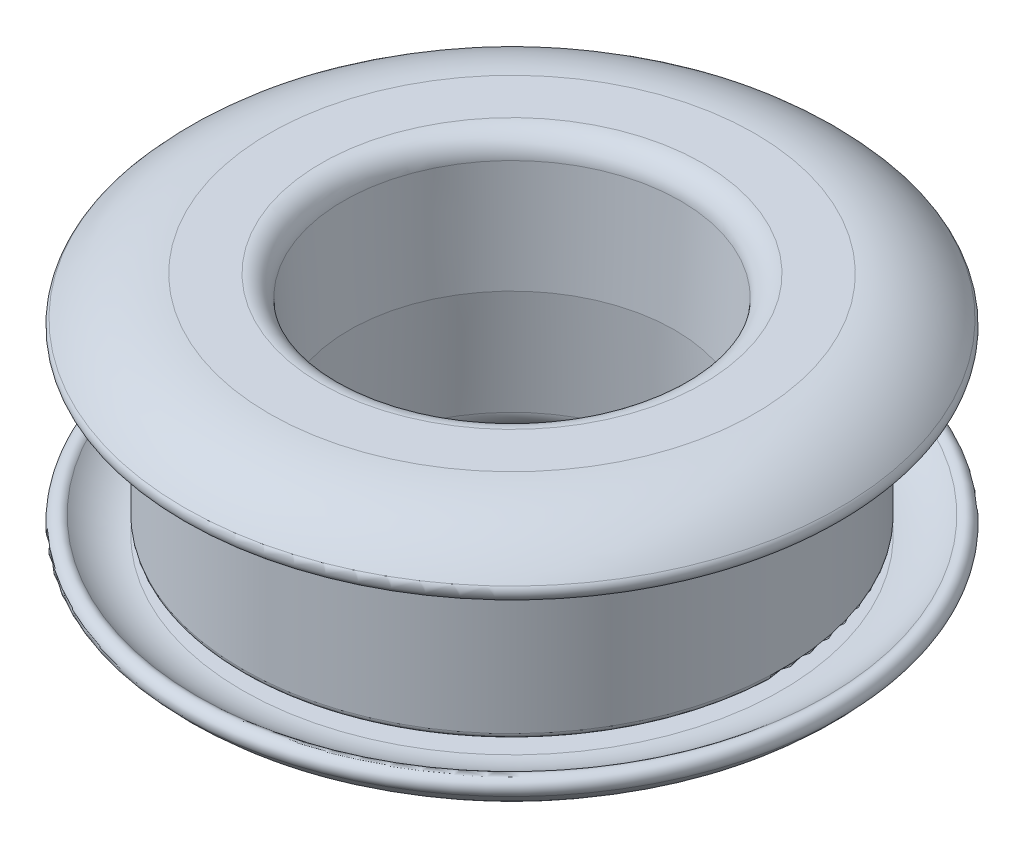
ISO-10303-21;
HEADER;
FILE_DESCRIPTION(('STEP AP214'),'2;1');
FILE_NAME('part.step','',(''),(''),'','','');
FILE_SCHEMA(('AUTOMOTIVE_DESIGN { 1 0 10303 214 1 1 1 1 }'));
ENDSEC;
DATA;
#1=APPLICATION_CONTEXT('core data for automotive mechanical design processes');
#2=APPLICATION_PROTOCOL_DEFINITION('international standard','automotive_design',2000,#1);
#3=PRODUCT_CONTEXT('',#1,'mechanical');
#4=PRODUCT('Part','Part','',(#3));
#5=PRODUCT_RELATED_PRODUCT_CATEGORY('part','',(#4));
#6=PRODUCT_DEFINITION_FORMATION('','',#4);
#7=PRODUCT_DEFINITION_CONTEXT('part definition',#1,'design');
#8=PRODUCT_DEFINITION('design','',#6,#7);
#9=PRODUCT_DEFINITION_SHAPE('','',#8);
#10=(LENGTH_UNIT() NAMED_UNIT(*) SI_UNIT(.MILLI.,.METRE.));
#11=(NAMED_UNIT(*) PLANE_ANGLE_UNIT() SI_UNIT($,.RADIAN.));
#12=(NAMED_UNIT(*) SI_UNIT($,.STERADIAN.) SOLID_ANGLE_UNIT());
#13=UNCERTAINTY_MEASURE_WITH_UNIT(LENGTH_MEASURE(1.E-05),#10,'distance_accuracy_value','');
#14=(GEOMETRIC_REPRESENTATION_CONTEXT(3) GLOBAL_UNCERTAINTY_ASSIGNED_CONTEXT((#13)) GLOBAL_UNIT_ASSIGNED_CONTEXT((#10,
#11,#12)) REPRESENTATION_CONTEXT('',''));
#15=CARTESIAN_POINT('',(0.,0.,0.));
#16=DIRECTION('',(0.,0.,1.));
#17=DIRECTION('',(1.,0.,0.));
#18=AXIS2_PLACEMENT_3D('',#15,#16,#17);
#19=CARTESIAN_POINT('',(0.,12.3249333288571,0.));
#20=DIRECTION('',(0.,1.,0.));
#21=DIRECTION('',(0.,0.,1.));
#22=AXIS2_PLACEMENT_3D('',#19,#20,#21);
#23=CONICAL_SURFACE('',#22,19.05,0.05235987755983);
#24=CARTESIAN_POINT('',(0.,0.,0.));
#25=DIRECTION('',(0.,-1.,0.));
#26=DIRECTION('',(0.,0.,-1.));
#27=AXIS2_PLACEMENT_3D('',#24,#25,#26);
#28=CIRCLE('',#27,18.4040776144231);
#29=CARTESIAN_POINT('',(0.,0.,-18.4040776144231));
#30=VERTEX_POINT('',#29);
#31=EDGE_CURVE('E76',#30,#30,#28,.T.);
#32=ORIENTED_EDGE('',*,*,#31,.T.);
#33=EDGE_LOOP('',(#32));
#34=FACE_BOUND('',#33,.T.);
#35=CARTESIAN_POINT('',(0.,12.3249333288571,0.));
#36=DIRECTION('',(0.,-1.,0.));
#37=DIRECTION('',(0.,0.,-1.));
#38=AXIS2_PLACEMENT_3D('',#35,#36,#37);
#39=CIRCLE('',#38,19.05);
#40=CARTESIAN_POINT('',(0.,12.3249333288571,-19.05));
#41=VERTEX_POINT('',#40);
#42=EDGE_CURVE('E52',#41,#41,#39,.T.);
#43=ORIENTED_EDGE('',*,*,#42,.F.);
#44=EDGE_LOOP('',(#43));
#45=FACE_BOUND('',#44,.T.);
#46=ADVANCED_FACE('F32',(#34,#45),#23,.F.);
#47=CARTESIAN_POINT('',(0.,12.192,0.));
#48=DIRECTION('',(0.,-1.,0.));
#49=DIRECTION('',(0.,0.,-1.));
#50=AXIS2_PLACEMENT_3D('',#47,#48,#49);
#51=TOROIDAL_SURFACE('',#50,21.5865190182766,2.54);
#52=ORIENTED_EDGE('',*,*,#42,.T.);
#53=EDGE_LOOP('',(#52));
#54=FACE_BOUND('',#53,.T.);
#55=CARTESIAN_POINT('',(0.,14.732,0.));
#56=DIRECTION('',(0.,-1.,0.));
#57=DIRECTION('',(0.,0.,-1.));
#58=AXIS2_PLACEMENT_3D('',#55,#56,#57);
#59=CIRCLE('',#58,21.5865190182766);
#60=CARTESIAN_POINT('',(0.,14.732,-21.5865190182766));
#61=VERTEX_POINT('',#60);
#62=EDGE_CURVE('E55',#61,#61,#59,.T.);
#63=ORIENTED_EDGE('',*,*,#62,.F.);
#64=EDGE_LOOP('',(#63));
#65=FACE_BOUND('',#64,.T.);
#66=ADVANCED_FACE('F118',(#54,#65),#51,.T.);
#67=CARTESIAN_POINT('',(21.5865190182766,14.732,0.));
#68=DIRECTION('',(0.,1.,0.));
#69=DIRECTION('',(0.,0.,1.));
#70=AXIS2_PLACEMENT_3D('',#67,#68,#69);
#71=PLANE('',#70);
#72=ORIENTED_EDGE('',*,*,#62,.T.);
#73=EDGE_LOOP('',(#72));
#74=FACE_BOUND('',#73,.T.);
#75=CARTESIAN_POINT('',(0.,14.732,0.));
#76=DIRECTION('',(0.,-1.,0.));
#77=DIRECTION('',(0.,0.,-1.));
#78=AXIS2_PLACEMENT_3D('',#75,#76,#77);
#79=CIRCLE('',#78,27.4444723618816);
#80=CARTESIAN_POINT('',(0.,14.732,-27.4444723618816));
#81=VERTEX_POINT('',#80);
#82=EDGE_CURVE('E58',#81,#81,#79,.T.);
#83=ORIENTED_EDGE('',*,*,#82,.F.);
#84=EDGE_LOOP('',(#83));
#85=FACE_BOUND('',#84,.T.);
#86=ADVANCED_FACE('F124',(#74,#85),#71,.T.);
#87=CARTESIAN_POINT('',(0.,2.17906123567877,0.));
#88=DIRECTION('',(0.,-1.,0.));
#89=DIRECTION('',(0.,0.,-1.));
#90=AXIS2_PLACEMENT_3D('',#87,#88,#89);
#91=TOROIDAL_SURFACE('',#90,27.4444723618816,12.5529387643212);
#92=ORIENTED_EDGE('',*,*,#82,.T.);
#93=EDGE_LOOP('',(#92));
#94=FACE_BOUND('',#93,.T.);
#95=CARTESIAN_POINT('',(0.,10.3021099592483,0.));
#96=DIRECTION('',(0.,-1.,0.));
#97=DIRECTION('',(0.,0.,-1.));
#98=AXIS2_PLACEMENT_3D('',#95,#96,#97);
#99=CIRCLE('',#98,37.0148616463002);
#100=CARTESIAN_POINT('',(0.,10.3021099592483,-37.0148616463002));
#101=VERTEX_POINT('',#100);
#102=EDGE_CURVE('E61',#101,#101,#99,.T.);
#103=ORIENTED_EDGE('',*,*,#102,.F.);
#104=EDGE_LOOP('',(#103));
#105=FACE_BOUND('',#104,.T.);
#106=ADVANCED_FACE('F171',(#94,#105),#91,.T.);
#107=CARTESIAN_POINT('',(0.,9.64465295590468,0.));
#108=DIRECTION('',(0.,-1.,0.));
#109=DIRECTION('',(0.,0.,-1.));
#110=AXIS2_PLACEMENT_3D('',#107,#108,#109);
#111=TOROIDAL_SURFACE('',#110,36.2402609176958,1.016);
#112=ORIENTED_EDGE('',*,*,#102,.T.);
#113=EDGE_LOOP('',(#112));
#114=FACE_BOUND('',#113,.T.);
#115=CARTESIAN_POINT('',(0.,8.89000000000001,0.));
#116=DIRECTION('',(0.,-1.,0.));
#117=DIRECTION('',(0.,0.,-1.));
#118=AXIS2_PLACEMENT_3D('',#115,#116,#117);
#119=CIRCLE('',#118,35.56);
#120=CARTESIAN_POINT('',(0.,8.89000000000001,-35.56));
#121=VERTEX_POINT('',#120);
#122=EDGE_CURVE('E64',#121,#121,#119,.T.);
#123=ORIENTED_EDGE('',*,*,#122,.F.);
#124=EDGE_LOOP('',(#123));
#125=FACE_BOUND('',#124,.T.);
#126=ADVANCED_FACE('F167',(#114,#125),#111,.T.);
#127=CARTESIAN_POINT('',(0.,3.2544608763044,0.));
#128=DIRECTION('',(0.,-1.,0.));
#129=DIRECTION('',(0.,0.,-1.));
#130=AXIS2_PLACEMENT_3D('',#127,#128,#129);
#131=TOROIDAL_SURFACE('',#130,30.48,7.58720641703544);
#132=ORIENTED_EDGE('',*,*,#122,.T.);
#133=EDGE_LOOP('',(#132));
#134=FACE_BOUND('',#133,.T.);
#135=CARTESIAN_POINT('',(0.,10.8416672933398,0.));
#136=DIRECTION('',(0.,-1.,0.));
#137=DIRECTION('',(0.,0.,-1.));
#138=AXIS2_PLACEMENT_3D('',#135,#136,#137);
#139=CIRCLE('',#138,30.48);
#140=CARTESIAN_POINT('',(0.,10.8416672933398,-30.48));
#141=VERTEX_POINT('',#140);
#142=EDGE_CURVE('E67',#141,#141,#139,.T.);
#143=ORIENTED_EDGE('',*,*,#142,.F.);
#144=EDGE_LOOP('',(#143));
#145=FACE_BOUND('',#144,.T.);
#146=ADVANCED_FACE('F161',(#134,#145),#131,.F.);
#147=CARTESIAN_POINT('',(24.820547675882,10.8416672933398,0.));
#148=DIRECTION('',(0.,-1.,0.));
#149=DIRECTION('',(0.,0.,-1.));
#150=AXIS2_PLACEMENT_3D('',#147,#148,#149);
#151=PLANE('',#150);
#152=ORIENTED_EDGE('',*,*,#142,.T.);
#153=EDGE_LOOP('',(#152));
#154=FACE_BOUND('',#153,.T.);
#155=CARTESIAN_POINT('',(0.,10.8416672933398,0.));
#156=DIRECTION('',(0.,-1.,0.));
#157=DIRECTION('',(0.,0.,-1.));
#158=AXIS2_PLACEMENT_3D('',#155,#156,#157);
#159=CIRCLE('',#158,24.820547675882);
#160=CARTESIAN_POINT('',(0.,10.8416672933398,-24.820547675882));
#161=VERTEX_POINT('',#160);
#162=EDGE_CURVE('E70',#161,#161,#159,.T.);
#163=ORIENTED_EDGE('',*,*,#162,.F.);
#164=EDGE_LOOP('',(#163));
#165=FACE_BOUND('',#164,.T.);
#166=ADVANCED_FACE('F155',(#154,#165),#151,.T.);
#167=CARTESIAN_POINT('',(0.,10.1198336466699,0.));
#168=DIRECTION('',(0.,-1.,0.));
#169=DIRECTION('',(0.,0.,-1.));
#170=AXIS2_PLACEMENT_3D('',#167,#168,#169);
#171=TOROIDAL_SURFACE('',#170,24.13,0.998949401186445);
#172=ORIENTED_EDGE('',*,*,#162,.T.);
#173=EDGE_LOOP('',(#172));
#174=FACE_BOUND('',#173,.T.);
#175=CARTESIAN_POINT('',(0.,9.398,0.));
#176=DIRECTION('',(0.,-1.,0.));
#177=DIRECTION('',(0.,0.,-1.));
#178=AXIS2_PLACEMENT_3D('',#175,#176,#177);
#179=CIRCLE('',#178,24.820547675882);
#180=CARTESIAN_POINT('',(0.,9.398,-24.820547675882));
#181=VERTEX_POINT('',#180);
#182=EDGE_CURVE('E73',#181,#181,#179,.T.);
#183=ORIENTED_EDGE('',*,*,#182,.F.);
#184=EDGE_LOOP('',(#183));
#185=FACE_BOUND('',#184,.T.);
#186=ADVANCED_FACE('F150',(#174,#185),#171,.F.);
#187=CARTESIAN_POINT('',(30.48,9.398,0.));
#188=DIRECTION('',(0.,1.,0.));
#189=DIRECTION('',(0.,0.,1.));
#190=AXIS2_PLACEMENT_3D('',#187,#188,#189);
#191=PLANE('',#190);
#192=CARTESIAN_POINT('',(0.,9.398,0.));
#193=DIRECTION('',(0.,1.,0.));
#194=DIRECTION('',(0.,0.,1.));
#195=AXIS2_PLACEMENT_3D('',#192,#193,#194);
#196=CIRCLE('',#195,29.845);
#197=CARTESIAN_POINT('',(0.,9.398,29.845));
#198=VERTEX_POINT('',#197);
#199=EDGE_CURVE('E43',#198,#198,#196,.T.);
#200=ORIENTED_EDGE('',*,*,#199,.T.);
#201=EDGE_LOOP('',(#200));
#202=FACE_BOUND('',#201,.T.);
#203=ORIENTED_EDGE('',*,*,#182,.T.);
#204=EDGE_LOOP('',(#203));
#205=FACE_BOUND('',#204,.T.);
#206=ADVANCED_FACE('F141',(#202,#205),#191,.T.);
#207=CARTESIAN_POINT('',(0.,0.,0.));
#208=DIRECTION('',(0.,-1.,0.));
#209=DIRECTION('',(0.,0.,-1.));
#210=AXIS2_PLACEMENT_3D('',#207,#208,#209);
#211=CYLINDRICAL_SURFACE('',#210,30.48);
#212=CARTESIAN_POINT('',(0.,-8.763,0.));
#213=DIRECTION('',(0.,-1.,0.));
#214=DIRECTION('',(0.,0.,-1.));
#215=AXIS2_PLACEMENT_3D('',#212,#213,#214);
#216=CIRCLE('',#215,30.48);
#217=CARTESIAN_POINT('',(0.,-8.763,-30.48));
#218=VERTEX_POINT('',#217);
#219=EDGE_CURVE('E10',#218,#218,#216,.F.);
#220=ORIENTED_EDGE('',*,*,#219,.T.);
#221=EDGE_LOOP('',(#220));
#222=FACE_BOUND('',#221,.T.);
#223=CARTESIAN_POINT('',(0.,8.763,0.));
#224=DIRECTION('',(0.,1.,0.));
#225=DIRECTION('',(0.,0.,1.));
#226=AXIS2_PLACEMENT_3D('',#223,#224,#225);
#227=CIRCLE('',#226,30.48);
#228=CARTESIAN_POINT('',(0.,8.763,30.48));
#229=VERTEX_POINT('',#228);
#230=EDGE_CURVE('E47',#229,#229,#227,.F.);
#231=ORIENTED_EDGE('',*,*,#230,.T.);
#232=EDGE_LOOP('',(#231));
#233=FACE_BOUND('',#232,.T.);
#234=ADVANCED_FACE('F132',(#222,#233),#211,.T.);
#235=CARTESIAN_POINT('',(0.,8.763,0.));
#236=DIRECTION('',(0.,1.,0.));
#237=DIRECTION('',(0.,0.,1.));
#238=AXIS2_PLACEMENT_3D('',#235,#236,#237);
#239=TOROIDAL_SURFACE('',#238,29.845,0.635);
#240=ORIENTED_EDGE('',*,*,#199,.F.);
#241=EDGE_LOOP('',(#240));
#242=FACE_BOUND('',#241,.T.);
#243=ORIENTED_EDGE('',*,*,#230,.F.);
#244=EDGE_LOOP('',(#243));
#245=FACE_BOUND('',#244,.T.);
#246=ADVANCED_FACE('F129',(#242,#245),#239,.T.);
#247=CARTESIAN_POINT('',(0.,-12.3249333288571,0.));
#248=DIRECTION('',(0.,-1.,0.));
#249=DIRECTION('',(0.,0.,1.));
#250=AXIS2_PLACEMENT_3D('',#247,#248,#249);
#251=CONICAL_SURFACE('',#250,19.05,0.05235987755983);
#252=ORIENTED_EDGE('',*,*,#31,.F.);
#253=EDGE_LOOP('',(#252));
#254=FACE_BOUND('',#253,.T.);
#255=CARTESIAN_POINT('',(0.,-12.3249333288571,0.));
#256=DIRECTION('',(0.,-1.,0.));
#257=DIRECTION('',(0.,0.,-1.));
#258=AXIS2_PLACEMENT_3D('',#255,#256,#257);
#259=CIRCLE('',#258,19.05);
#260=CARTESIAN_POINT('',(0.,-12.3249333288571,-19.05));
#261=VERTEX_POINT('',#260);
#262=EDGE_CURVE('E79',#261,#261,#259,.T.);
#263=ORIENTED_EDGE('',*,*,#262,.T.);
#264=EDGE_LOOP('',(#263));
#265=FACE_BOUND('',#264,.T.);
#266=ADVANCED_FACE('F131',(#254,#265),#251,.F.);
#267=CARTESIAN_POINT('',(0.,-12.192,0.));
#268=DIRECTION('',(0.,1.,0.));
#269=DIRECTION('',(0.,0.,-1.));
#270=AXIS2_PLACEMENT_3D('',#267,#268,#269);
#271=TOROIDAL_SURFACE('',#270,21.5865190182766,2.54);
#272=ORIENTED_EDGE('',*,*,#262,.F.);
#273=EDGE_LOOP('',(#272));
#274=FACE_BOUND('',#273,.T.);
#275=CARTESIAN_POINT('',(0.,-14.732,0.));
#276=DIRECTION('',(0.,-1.,0.));
#277=DIRECTION('',(0.,0.,-1.));
#278=AXIS2_PLACEMENT_3D('',#275,#276,#277);
#279=CIRCLE('',#278,21.5865190182766);
#280=CARTESIAN_POINT('',(0.,-14.732,-21.5865190182766));
#281=VERTEX_POINT('',#280);
#282=EDGE_CURVE('E82',#281,#281,#279,.T.);
#283=ORIENTED_EDGE('',*,*,#282,.T.);
#284=EDGE_LOOP('',(#283));
#285=FACE_BOUND('',#284,.T.);
#286=ADVANCED_FACE('F138',(#274,#285),#271,.T.);
#287=CARTESIAN_POINT('',(21.5865190182766,-14.732,0.));
#288=DIRECTION('',(0.,-1.,0.));
#289=DIRECTION('',(0.,0.,1.));
#290=AXIS2_PLACEMENT_3D('',#287,#288,#289);
#291=PLANE('',#290);
#292=ORIENTED_EDGE('',*,*,#282,.F.);
#293=EDGE_LOOP('',(#292));
#294=FACE_BOUND('',#293,.T.);
#295=CARTESIAN_POINT('',(0.,-14.732,0.));
#296=DIRECTION('',(0.,-1.,0.));
#297=DIRECTION('',(0.,0.,-1.));
#298=AXIS2_PLACEMENT_3D('',#295,#296,#297);
#299=CIRCLE('',#298,27.4444723618816);
#300=CARTESIAN_POINT('',(0.,-14.732,-27.4444723618816));
#301=VERTEX_POINT('',#300);
#302=EDGE_CURVE('E85',#301,#301,#299,.T.);
#303=ORIENTED_EDGE('',*,*,#302,.T.);
#304=EDGE_LOOP('',(#303));
#305=FACE_BOUND('',#304,.T.);
#306=ADVANCED_FACE('F245',(#294,#305),#291,.T.);
#307=CARTESIAN_POINT('',(0.,-2.17906123567877,0.));
#308=DIRECTION('',(0.,1.,0.));
#309=DIRECTION('',(0.,0.,-1.));
#310=AXIS2_PLACEMENT_3D('',#307,#308,#309);
#311=TOROIDAL_SURFACE('',#310,27.4444723618816,12.5529387643212);
#312=ORIENTED_EDGE('',*,*,#302,.F.);
#313=EDGE_LOOP('',(#312));
#314=FACE_BOUND('',#313,.T.);
#315=CARTESIAN_POINT('',(0.,-10.3021099592483,0.));
#316=DIRECTION('',(0.,-1.,0.));
#317=DIRECTION('',(0.,0.,-1.));
#318=AXIS2_PLACEMENT_3D('',#315,#316,#317);
#319=CIRCLE('',#318,37.0148616463002);
#320=CARTESIAN_POINT('',(0.,-10.3021099592483,-37.0148616463002));
#321=VERTEX_POINT('',#320);
#322=EDGE_CURVE('E88',#321,#321,#319,.T.);
#323=ORIENTED_EDGE('',*,*,#322,.T.);
#324=EDGE_LOOP('',(#323));
#325=FACE_BOUND('',#324,.T.);
#326=ADVANCED_FACE('F255',(#314,#325),#311,.T.);
#327=CARTESIAN_POINT('',(0.,-9.64465295590468,0.));
#328=DIRECTION('',(0.,1.,0.));
#329=DIRECTION('',(0.,0.,-1.));
#330=AXIS2_PLACEMENT_3D('',#327,#328,#329);
#331=TOROIDAL_SURFACE('',#330,36.2402609176958,1.016);
#332=ORIENTED_EDGE('',*,*,#322,.F.);
#333=EDGE_LOOP('',(#332));
#334=FACE_BOUND('',#333,.T.);
#335=CARTESIAN_POINT('',(0.,-8.89000000000001,0.));
#336=DIRECTION('',(0.,-1.,0.));
#337=DIRECTION('',(0.,0.,-1.));
#338=AXIS2_PLACEMENT_3D('',#335,#336,#337);
#339=CIRCLE('',#338,35.56);
#340=CARTESIAN_POINT('',(0.,-8.89000000000001,-35.56));
#341=VERTEX_POINT('',#340);
#342=EDGE_CURVE('E91',#341,#341,#339,.T.);
#343=ORIENTED_EDGE('',*,*,#342,.T.);
#344=EDGE_LOOP('',(#343));
#345=FACE_BOUND('',#344,.T.);
#346=ADVANCED_FACE('F265',(#334,#345),#331,.T.);
#347=CARTESIAN_POINT('',(0.,-3.2544608763044,0.));
#348=DIRECTION('',(0.,1.,0.));
#349=DIRECTION('',(0.,0.,-1.));
#350=AXIS2_PLACEMENT_3D('',#347,#348,#349);
#351=TOROIDAL_SURFACE('',#350,30.48,7.58720641703544);
#352=ORIENTED_EDGE('',*,*,#342,.F.);
#353=EDGE_LOOP('',(#352));
#354=FACE_BOUND('',#353,.T.);
#355=CARTESIAN_POINT('',(0.,-10.8416672933398,0.));
#356=DIRECTION('',(0.,-1.,0.));
#357=DIRECTION('',(0.,0.,-1.));
#358=AXIS2_PLACEMENT_3D('',#355,#356,#357);
#359=CIRCLE('',#358,30.48);
#360=CARTESIAN_POINT('',(0.,-10.8416672933398,-30.48));
#361=VERTEX_POINT('',#360);
#362=EDGE_CURVE('E94',#361,#361,#359,.T.);
#363=ORIENTED_EDGE('',*,*,#362,.T.);
#364=EDGE_LOOP('',(#363));
#365=FACE_BOUND('',#364,.T.);
#366=ADVANCED_FACE('F275',(#354,#365),#351,.F.);
#367=CARTESIAN_POINT('',(24.820547675882,-10.8416672933398,0.));
#368=DIRECTION('',(0.,1.,0.));
#369=DIRECTION('',(0.,0.,-1.));
#370=AXIS2_PLACEMENT_3D('',#367,#368,#369);
#371=PLANE('',#370);
#372=ORIENTED_EDGE('',*,*,#362,.F.);
#373=EDGE_LOOP('',(#372));
#374=FACE_BOUND('',#373,.T.);
#375=CARTESIAN_POINT('',(0.,-10.8416672933398,0.));
#376=DIRECTION('',(0.,-1.,0.));
#377=DIRECTION('',(0.,0.,-1.));
#378=AXIS2_PLACEMENT_3D('',#375,#376,#377);
#379=CIRCLE('',#378,24.820547675882);
#380=CARTESIAN_POINT('',(0.,-10.8416672933398,-24.820547675882));
#381=VERTEX_POINT('',#380);
#382=EDGE_CURVE('E97',#381,#381,#379,.T.);
#383=ORIENTED_EDGE('',*,*,#382,.T.);
#384=EDGE_LOOP('',(#383));
#385=FACE_BOUND('',#384,.T.);
#386=ADVANCED_FACE('F114',(#374,#385),#371,.T.);
#387=CARTESIAN_POINT('',(0.,-10.1198336466699,0.));
#388=DIRECTION('',(0.,1.,0.));
#389=DIRECTION('',(0.,0.,-1.));
#390=AXIS2_PLACEMENT_3D('',#387,#388,#389);
#391=TOROIDAL_SURFACE('',#390,24.13,0.998949401186445);
#392=ORIENTED_EDGE('',*,*,#382,.F.);
#393=EDGE_LOOP('',(#392));
#394=FACE_BOUND('',#393,.T.);
#395=CARTESIAN_POINT('',(0.,-9.398,0.));
#396=DIRECTION('',(0.,-1.,0.));
#397=DIRECTION('',(0.,0.,-1.));
#398=AXIS2_PLACEMENT_3D('',#395,#396,#397);
#399=CIRCLE('',#398,24.820547675882);
#400=CARTESIAN_POINT('',(0.,-9.398,-24.820547675882));
#401=VERTEX_POINT('',#400);
#402=EDGE_CURVE('E100',#401,#401,#399,.T.);
#403=ORIENTED_EDGE('',*,*,#402,.T.);
#404=EDGE_LOOP('',(#403));
#405=FACE_BOUND('',#404,.T.);
#406=ADVANCED_FACE('F104',(#394,#405),#391,.F.);
#407=CARTESIAN_POINT('',(30.48,-9.398,0.));
#408=DIRECTION('',(0.,-1.,0.));
#409=DIRECTION('',(0.,0.,1.));
#410=AXIS2_PLACEMENT_3D('',#407,#408,#409);
#411=PLANE('',#410);
#412=CARTESIAN_POINT('',(0.,-9.398,0.));
#413=DIRECTION('',(0.,-1.,0.));
#414=DIRECTION('',(0.,0.,-1.));
#415=AXIS2_PLACEMENT_3D('',#412,#413,#414);
#416=CIRCLE('',#415,29.845);
#417=CARTESIAN_POINT('',(0.,-9.398,-29.845));
#418=VERTEX_POINT('',#417);
#419=EDGE_CURVE('E39',#418,#418,#416,.T.);
#420=ORIENTED_EDGE('',*,*,#419,.T.);
#421=EDGE_LOOP('',(#420));
#422=FACE_BOUND('',#421,.T.);
#423=ORIENTED_EDGE('',*,*,#402,.F.);
#424=EDGE_LOOP('',(#423));
#425=FACE_BOUND('',#424,.T.);
#426=ADVANCED_FACE('F106',(#422,#425),#411,.T.);
#427=CARTESIAN_POINT('',(0.,-8.763,0.));
#428=DIRECTION('',(0.,-1.,0.));
#429=DIRECTION('',(0.,0.,-1.));
#430=AXIS2_PLACEMENT_3D('',#427,#428,#429);
#431=TOROIDAL_SURFACE('',#430,29.845,0.635);
#432=ORIENTED_EDGE('',*,*,#219,.F.);
#433=EDGE_LOOP('',(#432));
#434=FACE_BOUND('',#433,.T.);
#435=ORIENTED_EDGE('',*,*,#419,.F.);
#436=EDGE_LOOP('',(#435));
#437=FACE_BOUND('',#436,.T.);
#438=ADVANCED_FACE('F34',(#434,#437),#431,.T.);
#439=CLOSED_SHELL('',(#46,#66,#86,#106,#126,#146,#166,#186,#206,#234,#246,#266,#286,#306,#326,
#346,#366,#386,#406,#426,#438));
#440=MANIFOLD_SOLID_BREP('B2',#439);
#441=ADVANCED_BREP_SHAPE_REPRESENTATION('',(#18,#440),#14);
#442=SHAPE_DEFINITION_REPRESENTATION(#9,#441);
ENDSEC;
END-ISO-10303-21;
